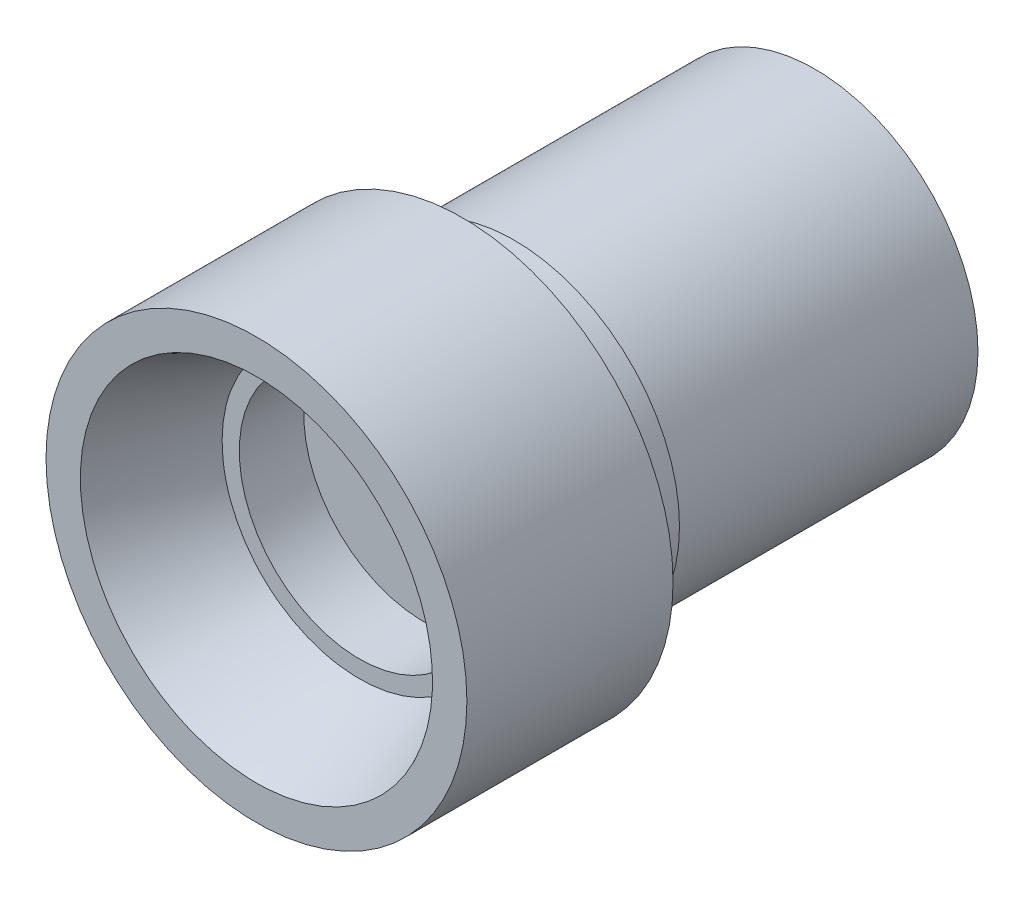
ISO-10303-21;
HEADER;
FILE_DESCRIPTION(('STEP AP214'),'2;1');
FILE_NAME('part.step','',(''),(''),'','','');
FILE_SCHEMA(('AUTOMOTIVE_DESIGN { 1 0 10303 214 1 1 1 1 }'));
ENDSEC;
DATA;
#1=APPLICATION_CONTEXT('core data for automotive mechanical design processes');
#2=APPLICATION_PROTOCOL_DEFINITION('international standard','automotive_design',2000,#1);
#3=PRODUCT_CONTEXT('',#1,'mechanical');
#4=PRODUCT('Part','Part','',(#3));
#5=PRODUCT_RELATED_PRODUCT_CATEGORY('part','',(#4));
#6=PRODUCT_DEFINITION_FORMATION('','',#4);
#7=PRODUCT_DEFINITION_CONTEXT('part definition',#1,'design');
#8=PRODUCT_DEFINITION('design','',#6,#7);
#9=PRODUCT_DEFINITION_SHAPE('','',#8);
#10=(LENGTH_UNIT() NAMED_UNIT(*) SI_UNIT(.MILLI.,.METRE.));
#11=(NAMED_UNIT(*) PLANE_ANGLE_UNIT() SI_UNIT($,.RADIAN.));
#12=(NAMED_UNIT(*) SI_UNIT($,.STERADIAN.) SOLID_ANGLE_UNIT());
#13=UNCERTAINTY_MEASURE_WITH_UNIT(LENGTH_MEASURE(1.E-05),#10,'distance_accuracy_value','');
#14=(GEOMETRIC_REPRESENTATION_CONTEXT(3) GLOBAL_UNCERTAINTY_ASSIGNED_CONTEXT((#13)) GLOBAL_UNIT_ASSIGNED_CONTEXT((#10,
#11,#12)) REPRESENTATION_CONTEXT('',''));
#15=CARTESIAN_POINT('',(0.,0.,0.));
#16=DIRECTION('',(0.,0.,1.));
#17=DIRECTION('',(1.,0.,0.));
#18=AXIS2_PLACEMENT_3D('',#15,#16,#17);
#19=CARTESIAN_POINT('',(0.,0.,-69.));
#20=DIRECTION('',(0.,0.,1.));
#21=DIRECTION('',(1.,0.,0.));
#22=AXIS2_PLACEMENT_3D('',#19,#20,#21);
#23=PLANE('',#22);
#24=CARTESIAN_POINT('',(0.,0.,-69.));
#25=DIRECTION('',(0.,0.,1.));
#26=DIRECTION('',(1.,0.,0.));
#27=AXIS2_PLACEMENT_3D('',#24,#25,#26);
#28=CIRCLE('',#27,12.9999999999999);
#29=CARTESIAN_POINT('',(12.9999999999999,0.,-69.));
#30=VERTEX_POINT('',#29);
#31=EDGE_CURVE('E11',#30,#30,#28,.F.);
#32=ORIENTED_EDGE('',*,*,#31,.T.);
#33=EDGE_LOOP('',(#32));
#34=FACE_BOUND('',#33,.T.);
#35=ADVANCED_FACE('F42',(#34),#23,.F.);
#36=CARTESIAN_POINT('',(0.,0.,0.));
#37=DIRECTION('',(0.,0.,1.));
#38=DIRECTION('',(1.,0.,0.));
#39=AXIS2_PLACEMENT_3D('',#36,#37,#38);
#40=CYLINDRICAL_SURFACE('',#39,19.);
#41=CARTESIAN_POINT('',(0.,0.,-65.));
#42=DIRECTION('',(0.,0.,1.));
#43=DIRECTION('',(1.,0.,0.));
#44=AXIS2_PLACEMENT_3D('',#41,#42,#43);
#45=CIRCLE('',#44,19.);
#46=CARTESIAN_POINT('',(19.,0.,-65.));
#47=VERTEX_POINT('',#46);
#48=EDGE_CURVE('E52',#47,#47,#45,.T.);
#49=ORIENTED_EDGE('',*,*,#48,.T.);
#50=EDGE_LOOP('',(#49));
#51=FACE_BOUND('',#50,.T.);
#52=CARTESIAN_POINT('',(0.,0.,-30.));
#53=DIRECTION('',(0.,0.,1.));
#54=DIRECTION('',(1.,0.,0.));
#55=AXIS2_PLACEMENT_3D('',#52,#53,#54);
#56=CIRCLE('',#55,19.);
#57=CARTESIAN_POINT('',(19.,0.,-30.));
#58=VERTEX_POINT('',#57);
#59=EDGE_CURVE('E57',#58,#58,#56,.T.);
#60=ORIENTED_EDGE('',*,*,#59,.F.);
#61=EDGE_LOOP('',(#60));
#62=FACE_BOUND('',#61,.T.);
#63=ADVANCED_FACE('F124',(#51,#62),#40,.T.);
#64=CARTESIAN_POINT('',(0.,0.,-30.));
#65=DIRECTION('',(0.,0.,1.));
#66=DIRECTION('',(1.,0.,0.));
#67=AXIS2_PLACEMENT_3D('',#64,#65,#66);
#68=PLANE('',#67);
#69=CARTESIAN_POINT('',(0.,0.,-30.));
#70=DIRECTION('',(0.,0.,1.));
#71=DIRECTION('',(1.,0.,0.));
#72=AXIS2_PLACEMENT_3D('',#69,#70,#71);
#73=CIRCLE('',#72,19.25);
#74=CARTESIAN_POINT('',(19.25,0.,-30.));
#75=VERTEX_POINT('',#74);
#76=EDGE_CURVE('E271',#75,#75,#73,.T.);
#77=ORIENTED_EDGE('',*,*,#76,.F.);
#78=EDGE_LOOP('',(#77));
#79=FACE_BOUND('',#78,.T.);
#80=ORIENTED_EDGE('',*,*,#59,.T.);
#81=EDGE_LOOP('',(#80));
#82=FACE_BOUND('',#81,.T.);
#83=ADVANCED_FACE('F120',(#79,#82),#68,.F.);
#84=CARTESIAN_POINT('',(0.,0.,0.));
#85=DIRECTION('',(0.,0.,1.));
#86=DIRECTION('',(1.,0.,0.));
#87=AXIS2_PLACEMENT_3D('',#84,#85,#86);
#88=CYLINDRICAL_SURFACE('',#87,19.25);
#89=ORIENTED_EDGE('',*,*,#76,.T.);
#90=EDGE_LOOP('',(#89));
#91=FACE_BOUND('',#90,.T.);
#92=CARTESIAN_POINT('',(0.,0.,-24.));
#93=DIRECTION('',(0.,0.,1.));
#94=DIRECTION('',(1.,0.,0.));
#95=AXIS2_PLACEMENT_3D('',#92,#93,#94);
#96=CIRCLE('',#95,19.25);
#97=CARTESIAN_POINT('',(19.25,0.,-24.));
#98=VERTEX_POINT('',#97);
#99=EDGE_CURVE('E273',#98,#98,#96,.T.);
#100=ORIENTED_EDGE('',*,*,#99,.F.);
#101=EDGE_LOOP('',(#100));
#102=FACE_BOUND('',#101,.T.);
#103=ADVANCED_FACE('F116',(#91,#102),#88,.T.);
#104=CARTESIAN_POINT('',(0.,0.,-24.));
#105=DIRECTION('',(0.,0.,1.));
#106=DIRECTION('',(1.,0.,0.));
#107=AXIS2_PLACEMENT_3D('',#104,#105,#106);
#108=PLANE('',#107);
#109=CARTESIAN_POINT('',(0.,0.,-24.));
#110=DIRECTION('',(0.,0.,1.));
#111=DIRECTION('',(1.,0.,0.));
#112=AXIS2_PLACEMENT_3D('',#109,#110,#111);
#113=CIRCLE('',#112,24.5);
#114=CARTESIAN_POINT('',(24.5,0.,-24.));
#115=VERTEX_POINT('',#114);
#116=EDGE_CURVE('E278',#115,#115,#113,.T.);
#117=ORIENTED_EDGE('',*,*,#116,.F.);
#118=EDGE_LOOP('',(#117));
#119=FACE_BOUND('',#118,.T.);
#120=ORIENTED_EDGE('',*,*,#99,.T.);
#121=EDGE_LOOP('',(#120));
#122=FACE_BOUND('',#121,.T.);
#123=ADVANCED_FACE('F112',(#119,#122),#108,.F.);
#124=CARTESIAN_POINT('',(0.,0.,0.));
#125=DIRECTION('',(0.,0.,1.));
#126=DIRECTION('',(1.,0.,0.));
#127=AXIS2_PLACEMENT_3D('',#124,#125,#126);
#128=CYLINDRICAL_SURFACE('',#127,24.5);
#129=ORIENTED_EDGE('',*,*,#116,.T.);
#130=EDGE_LOOP('',(#129));
#131=FACE_BOUND('',#130,.T.);
#132=CARTESIAN_POINT('',(0.,0.,0.));
#133=DIRECTION('',(0.,0.,1.));
#134=DIRECTION('',(1.,0.,0.));
#135=AXIS2_PLACEMENT_3D('',#132,#133,#134);
#136=CIRCLE('',#135,24.5);
#137=CARTESIAN_POINT('',(24.5,0.,0.));
#138=VERTEX_POINT('',#137);
#139=EDGE_CURVE('E72',#138,#138,#136,.T.);
#140=ORIENTED_EDGE('',*,*,#139,.F.);
#141=EDGE_LOOP('',(#140));
#142=FACE_BOUND('',#141,.T.);
#143=ADVANCED_FACE('F109',(#131,#142),#128,.T.);
#144=CARTESIAN_POINT('',(0.,0.,0.));
#145=DIRECTION('',(0.,0.,1.));
#146=DIRECTION('',(1.,0.,0.));
#147=AXIS2_PLACEMENT_3D('',#144,#145,#146);
#148=PLANE('',#147);
#149=CARTESIAN_POINT('',(0.,0.,0.));
#150=DIRECTION('',(0.,0.,1.));
#151=DIRECTION('',(1.,0.,0.));
#152=AXIS2_PLACEMENT_3D('',#149,#150,#151);
#153=CIRCLE('',#152,20.5);
#154=CARTESIAN_POINT('',(14.3308230664256,14.6587008373458,0.));
#155=VERTEX_POINT('',#154);
#156=EDGE_CURVE('E63',#155,#155,#153,.T.);
#157=ORIENTED_EDGE('',*,*,#156,.F.);
#158=EDGE_LOOP('',(#157));
#159=FACE_BOUND('',#158,.T.);
#160=ORIENTED_EDGE('',*,*,#139,.T.);
#161=EDGE_LOOP('',(#160));
#162=FACE_BOUND('',#161,.T.);
#163=ADVANCED_FACE('F64',(#159,#162),#148,.T.);
#164=CARTESIAN_POINT('',(0.,0.,-65.));
#165=DIRECTION('',(0.,0.,1.));
#166=DIRECTION('',(1.,0.,0.));
#167=AXIS2_PLACEMENT_3D('',#164,#165,#166);
#168=CONICAL_SURFACE('',#167,19.,0.982793723247331);
#169=ORIENTED_EDGE('',*,*,#31,.F.);
#170=EDGE_LOOP('',(#169));
#171=FACE_BOUND('',#170,.T.);
#172=ORIENTED_EDGE('',*,*,#48,.F.);
#173=EDGE_LOOP('',(#172));
#174=FACE_BOUND('',#173,.T.);
#175=ADVANCED_FACE('F44',(#171,#174),#168,.T.);
#176=CARTESIAN_POINT('',(0.,0.,-12.));
#177=DIRECTION('',(0.,0.,-1.));
#178=DIRECTION('',(-1.,0.,0.));
#179=AXIS2_PLACEMENT_3D('',#176,#177,#178);
#180=PLANE('',#179);
#181=CARTESIAN_POINT('',(0.,0.,-12.));
#182=DIRECTION('',(0.,0.,1.));
#183=DIRECTION('',(1.,0.,0.));
#184=AXIS2_PLACEMENT_3D('',#181,#182,#183);
#185=CIRCLE('',#184,14.);
#186=CARTESIAN_POINT('',(14.,0.,-12.));
#187=VERTEX_POINT('',#186);
#188=EDGE_CURVE('E247',#187,#187,#185,.T.);
#189=ORIENTED_EDGE('',*,*,#188,.F.);
#190=EDGE_LOOP('',(#189));
#191=FACE_BOUND('',#190,.T.);
#192=CARTESIAN_POINT('',(0.,0.,-12.));
#193=DIRECTION('',(0.,0.,-1.));
#194=DIRECTION('',(-1.,0.,0.));
#195=AXIS2_PLACEMENT_3D('',#192,#193,#194);
#196=CIRCLE('',#195,16.);
#197=CARTESIAN_POINT('',(13.8126378184436,8.07533507023088,-12.));
#198=VERTEX_POINT('',#197);
#199=EDGE_CURVE('E68',#198,#198,#196,.T.);
#200=ORIENTED_EDGE('',*,*,#199,.F.);
#201=EDGE_LOOP('',(#200));
#202=FACE_BOUND('',#201,.T.);
#203=ADVANCED_FACE('F92',(#191,#202),#180,.F.);
#204=CARTESIAN_POINT('',(14.3308230664256,14.6587008373458,0.));
#205=CARTESIAN_POINT('',(13.8126378184436,8.07533507023088,-12.));
#206=CARTESIAN_POINT('',(43.6482247411173,-14.0029452955055,0.));
#207=CARTESIAN_POINT('',(29.9633079589054,-19.5499405666564,-12.));
#208=CARTESIAN_POINT('',(14.986578608266,-43.3203469701971,0.));
#209=CARTESIAN_POINT('',(2.33803232201813,-35.7006107071182,-12.));
#210=CARTESIAN_POINT('',(-14.3308230664256,-14.6587008373458,0.));
#211=CARTESIAN_POINT('',(-13.8126378184436,-8.07533507023088,-12.));
#212=CARTESIAN_POINT('',(-43.6482247411173,14.0029452955055,0.));
#213=CARTESIAN_POINT('',(-29.9633079589054,19.5499405666564,-12.));
#214=CARTESIAN_POINT('',(-14.986578608266,43.3203469701971,0.));
#215=CARTESIAN_POINT('',(-2.33803232201812,35.7006107071181,-12.));
#216=CARTESIAN_POINT('',(14.3308230664256,14.6587008373458,0.));
#217=CARTESIAN_POINT('',(13.8126378184436,8.07533507023088,-12.));
#218=(BOUNDED_SURFACE() B_SPLINE_SURFACE(3,1,((#204,#205),(#206,#207),(#208,#209),(#210,#211),
(#212,#213),(#214,#215),(#216,#217)),.UNSPECIFIED.,.T.,.F.,.F.) B_SPLINE_SURFACE_WITH_KNOTS((4,
3,4),(2,2),(0.,0.5,1.),(0.,1.),
.UNSPECIFIED.) GEOMETRIC_REPRESENTATION_ITEM() RATIONAL_B_SPLINE_SURFACE(((1.,1.),
(0.333333333333333,0.333333333333333),(0.333333333333333,0.333333333333333),(1.,1.),
(0.333333333333333,0.333333333333333),(0.333333333333333,0.333333333333333),(1.,1.))) REPRESENTATION_ITEM('') SURFACE());
#219=CARTESIAN_POINT('',(14.3308230664256,14.6587008373458,0.));
#220=CARTESIAN_POINT('',(14.3254253034258,14.590124110605,-0.124999999999999));
#221=CARTESIAN_POINT('',(14.320027540426,14.5215473838642,-0.25));
#222=CARTESIAN_POINT('',(14.3092320144264,14.3843939303827,-0.5));
#223=CARTESIAN_POINT('',(14.3038342514266,14.3158172036419,-0.625));
#224=CARTESIAN_POINT('',(14.293038725427,14.1786637501603,-0.875));
#225=CARTESIAN_POINT('',(14.2876409624271,14.1100870234196,-1.));
#226=CARTESIAN_POINT('',(14.2768454364275,13.972933569938,-1.25));
#227=CARTESIAN_POINT('',(14.2714476734277,13.9043568431972,-1.375));
#228=CARTESIAN_POINT('',(14.2606521474281,13.7672033897157,-1.625));
#229=CARTESIAN_POINT('',(14.2552543844283,13.6986266629749,-1.75));
#230=CARTESIAN_POINT('',(14.2444588584286,13.5614732094933,-2.));
#231=CARTESIAN_POINT('',(14.2390610954288,13.4928964827525,-2.125));
#232=CARTESIAN_POINT('',(14.2282655694292,13.355743029271,-2.375));
#233=CARTESIAN_POINT('',(14.2228678064294,13.2871663025302,-2.5));
#234=CARTESIAN_POINT('',(14.2120722804298,13.1500128490486,-2.75));
#235=CARTESIAN_POINT('',(14.20667451743,13.0814361223079,-2.875));
#236=CARTESIAN_POINT('',(14.1958789914303,12.9442826688263,-3.125));
#237=CARTESIAN_POINT('',(14.1904812284305,12.8757059420855,-3.25));
#238=CARTESIAN_POINT('',(14.1796857024309,12.738552488604,-3.5));
#239=CARTESIAN_POINT('',(14.1742879394311,12.6699757618632,-3.625));
#240=CARTESIAN_POINT('',(14.1634924134315,12.5328223083816,-3.875));
#241=CARTESIAN_POINT('',(14.1580946504316,12.4642455816408,-4.));
#242=CARTESIAN_POINT('',(14.147299124432,12.3270921281593,-4.25));
#243=CARTESIAN_POINT('',(14.1419013614322,12.2585154014185,-4.375));
#244=CARTESIAN_POINT('',(14.1311058354326,12.1213619479369,-4.625));
#245=CARTESIAN_POINT('',(14.1257080724328,12.0527852211962,-4.75));
#246=CARTESIAN_POINT('',(14.1149125464331,11.9156317677146,-5.));
#247=CARTESIAN_POINT('',(14.1095147834333,11.8470550409738,-5.125));
#248=CARTESIAN_POINT('',(14.0987192574337,11.7099015874922,-5.375));
#249=CARTESIAN_POINT('',(14.0933214944339,11.6413248607515,-5.5));
#250=CARTESIAN_POINT('',(14.0825259684343,11.5041714072699,-5.75));
#251=CARTESIAN_POINT('',(14.0771282054344,11.4355946805291,-5.875));
#252=CARTESIAN_POINT('',(14.0663326794348,11.2984412270476,-6.125));
#253=CARTESIAN_POINT('',(14.060934916435,11.2298645003068,-6.25));
#254=CARTESIAN_POINT('',(14.0501393904354,11.0927110468252,-6.5));
#255=CARTESIAN_POINT('',(14.0447416274356,11.0241343200844,-6.625));
#256=CARTESIAN_POINT('',(14.0339461014359,10.8869808666029,-6.875));
#257=CARTESIAN_POINT('',(14.0285483384361,10.8184041398621,-7.));
#258=CARTESIAN_POINT('',(14.0177528124365,10.6812506863805,-7.25));
#259=CARTESIAN_POINT('',(14.0123550494367,10.6126739596398,-7.375));
#260=CARTESIAN_POINT('',(14.0015595234371,10.4755205061582,-7.625));
#261=CARTESIAN_POINT('',(13.9961617604373,10.4069437794174,-7.75));
#262=CARTESIAN_POINT('',(13.9853662344376,10.2697903259359,-8.));
#263=CARTESIAN_POINT('',(13.9799684714378,10.2012135991951,-8.125));
#264=CARTESIAN_POINT('',(13.9691729454382,10.0640601457135,-8.375));
#265=CARTESIAN_POINT('',(13.9637751824384,9.99548341897274,-8.5));
#266=CARTESIAN_POINT('',(13.9529796564388,9.85832996549117,-8.75));
#267=CARTESIAN_POINT('',(13.9475818934389,9.78975323875039,-8.875));
#268=CARTESIAN_POINT('',(13.9367863674393,9.65259978526883,-9.125));
#269=CARTESIAN_POINT('',(13.9313886044395,9.58402305852805,-9.25));
#270=CARTESIAN_POINT('',(13.9205930784399,9.44686960504649,-9.5));
#271=CARTESIAN_POINT('',(13.9151953154401,9.37829287830571,-9.625));
#272=CARTESIAN_POINT('',(13.9043997894404,9.24113942482415,-9.875));
#273=CARTESIAN_POINT('',(13.8990020264406,9.17256269808337,-10.));
#274=CARTESIAN_POINT('',(13.888206500441,9.03540924460181,-10.25));
#275=CARTESIAN_POINT('',(13.8828087374412,8.96683251786103,-10.375));
#276=CARTESIAN_POINT('',(13.8720132114416,8.82967906437947,-10.625));
#277=CARTESIAN_POINT('',(13.8666154484418,8.76110233763869,-10.75));
#278=CARTESIAN_POINT('',(13.8558199224421,8.62394888415712,-11.));
#279=CARTESIAN_POINT('',(13.8504221594423,8.55537215741635,-11.125));
#280=CARTESIAN_POINT('',(13.8396266334427,8.41821870393478,-11.375));
#281=CARTESIAN_POINT('',(13.8342288704429,8.349641977194,-11.5));
#282=CARTESIAN_POINT('',(13.8234333444433,8.21248852371244,-11.75));
#283=CARTESIAN_POINT('',(13.8180355814434,8.14391179697166,-11.875));
#284=CARTESIAN_POINT('',(13.8126378184436,8.07533507023088,-12.));
#285=B_SPLINE_CURVE_WITH_KNOTS('',3,(#219,#220,#221,#222,#223,#224,#225,#226,#227,#228,#229,
#230,#231,#232,#233,#234,#235,#236,#237,#238,#239,#240,#241,#242,#243,#244,#245,#246,#247,#248,
#249,#250,#251,#252,#253,#254,#255,#256,#257,#258,#259,#260,#261,#262,#263,#264,#265,#266,#267,
#268,#269,#270,#271,#272,#273,#274,#275,#276,#277,#278,#279,#280,#281,#282,#283,#284),
.UNSPECIFIED.,.F.,.F.,(4,2,2,2,2,2,2,2,2,2,2,2,2,2,2,2,2,2,2,2,2,2,2,2,2,2,2,2,2,2,2,2,4),(0.,
0.428032860494304,0.856065720988608,1.28409858148291,1.71213144197722,2.14016430247152,
2.56819716296582,2.99623002346013,3.42426288395443,3.85229574444874,4.28032860494304,
4.70836146543735,5.13639432593165,5.56442718642595,5.99246004692026,6.42049290741456,
6.84852576790886,7.27655862840317,7.70459148889747,8.13262434939178,8.56065720988608,
8.98869007038039,9.41672293087469,9.84475579136899,10.2727886518633,10.7008215123576,
11.1288543728519,11.5568872333462,11.9849200938405,12.4129529543348,12.8409858148291,
13.2690186753234,13.6970515358177),.UNSPECIFIED.);
#286=EDGE_CURVE('BSEAM100',#155,#198,#285,.T.);
#287=ORIENTED_EDGE('',*,*,#156,.T.);
#288=ORIENTED_EDGE('',*,*,#199,.T.);
#289=ORIENTED_EDGE('',*,*,#286,.T.);
#290=ORIENTED_EDGE('',*,*,#286,.F.);
#291=EDGE_LOOP('',(#287,#289,#288,#290));
#292=FACE_BOUND('',#291,.T.);
#293=ADVANCED_FACE('F100',(#292),#218,.F.);
#294=CARTESIAN_POINT('',(0.,0.,-28.));
#295=DIRECTION('',(0.,0.,-1.));
#296=DIRECTION('',(-1.,0.,0.));
#297=AXIS2_PLACEMENT_3D('',#294,#295,#296);
#298=PLANE('',#297);
#299=CARTESIAN_POINT('',(0.,0.,-28.));
#300=DIRECTION('',(0.,0.,1.));
#301=DIRECTION('',(1.,0.,0.));
#302=AXIS2_PLACEMENT_3D('',#299,#300,#301);
#303=CIRCLE('',#302,6.50000000000001);
#304=CARTESIAN_POINT('',(6.50000000000001,0.,-28.));
#305=VERTEX_POINT('',#304);
#306=EDGE_CURVE('E69',#305,#305,#303,.T.);
#307=ORIENTED_EDGE('',*,*,#306,.T.);
#308=EDGE_LOOP('',(#307));
#309=FACE_BOUND('',#308,.T.);
#310=ADVANCED_FACE('F173',(#309),#298,.F.);
#311=CARTESIAN_POINT('',(0.,0.,-12.));
#312=DIRECTION('',(0.,0.,1.));
#313=DIRECTION('',(1.,0.,0.));
#314=AXIS2_PLACEMENT_3D('',#311,#312,#313);
#315=CYLINDRICAL_SURFACE('',#314,6.50000000000001);
#316=ORIENTED_EDGE('',*,*,#306,.F.);
#317=EDGE_LOOP('',(#316));
#318=FACE_BOUND('',#317,.T.);
#319=CARTESIAN_POINT('',(0.,0.,-19.5));
#320=DIRECTION('',(0.,0.,1.));
#321=DIRECTION('',(1.,0.,0.));
#322=AXIS2_PLACEMENT_3D('',#319,#320,#321);
#323=CIRCLE('',#322,6.50000000000001);
#324=CARTESIAN_POINT('',(6.50000000000001,0.,-19.5));
#325=VERTEX_POINT('',#324);
#326=EDGE_CURVE('E75',#325,#325,#323,.T.);
#327=ORIENTED_EDGE('',*,*,#326,.T.);
#328=EDGE_LOOP('',(#327));
#329=FACE_BOUND('',#328,.T.);
#330=ADVANCED_FACE('F178',(#318,#329),#315,.F.);
#331=CARTESIAN_POINT('',(6.50000000000001,0.,-19.5));
#332=DIRECTION('',(0.,0.,-1.));
#333=DIRECTION('',(-1.,0.,0.));
#334=AXIS2_PLACEMENT_3D('',#331,#332,#333);
#335=PLANE('',#334);
#336=ORIENTED_EDGE('',*,*,#326,.F.);
#337=EDGE_LOOP('',(#336));
#338=FACE_BOUND('',#337,.T.);
#339=CARTESIAN_POINT('',(0.,0.,-19.5));
#340=DIRECTION('',(0.,0.,1.));
#341=DIRECTION('',(1.,0.,0.));
#342=AXIS2_PLACEMENT_3D('',#339,#340,#341);
#343=CIRCLE('',#342,14.);
#344=CARTESIAN_POINT('',(14.,0.,-19.5));
#345=VERTEX_POINT('',#344);
#346=EDGE_CURVE('E244',#345,#345,#343,.T.);
#347=ORIENTED_EDGE('',*,*,#346,.T.);
#348=EDGE_LOOP('',(#347));
#349=FACE_BOUND('',#348,.T.);
#350=ADVANCED_FACE('F185',(#338,#349),#335,.F.);
#351=CARTESIAN_POINT('',(0.,0.,-12.));
#352=DIRECTION('',(0.,0.,1.));
#353=DIRECTION('',(1.,0.,0.));
#354=AXIS2_PLACEMENT_3D('',#351,#352,#353);
#355=CYLINDRICAL_SURFACE('',#354,14.);
#356=ORIENTED_EDGE('',*,*,#346,.F.);
#357=EDGE_LOOP('',(#356));
#358=FACE_BOUND('',#357,.T.);
#359=ORIENTED_EDGE('',*,*,#188,.T.);
#360=EDGE_LOOP('',(#359));
#361=FACE_BOUND('',#360,.T.);
#362=ADVANCED_FACE('F193',(#358,#361),#355,.F.);
#363=CLOSED_SHELL('',(#35,#63,#83,#103,#123,#143,#163,#175,#203,#293,#310,#330,#350,#362));
#364=MANIFOLD_SOLID_BREP('B2',#363);
#365=ADVANCED_BREP_SHAPE_REPRESENTATION('',(#18,#364),#14);
#366=SHAPE_DEFINITION_REPRESENTATION(#9,#365);
ENDSEC;
END-ISO-10303-21;
